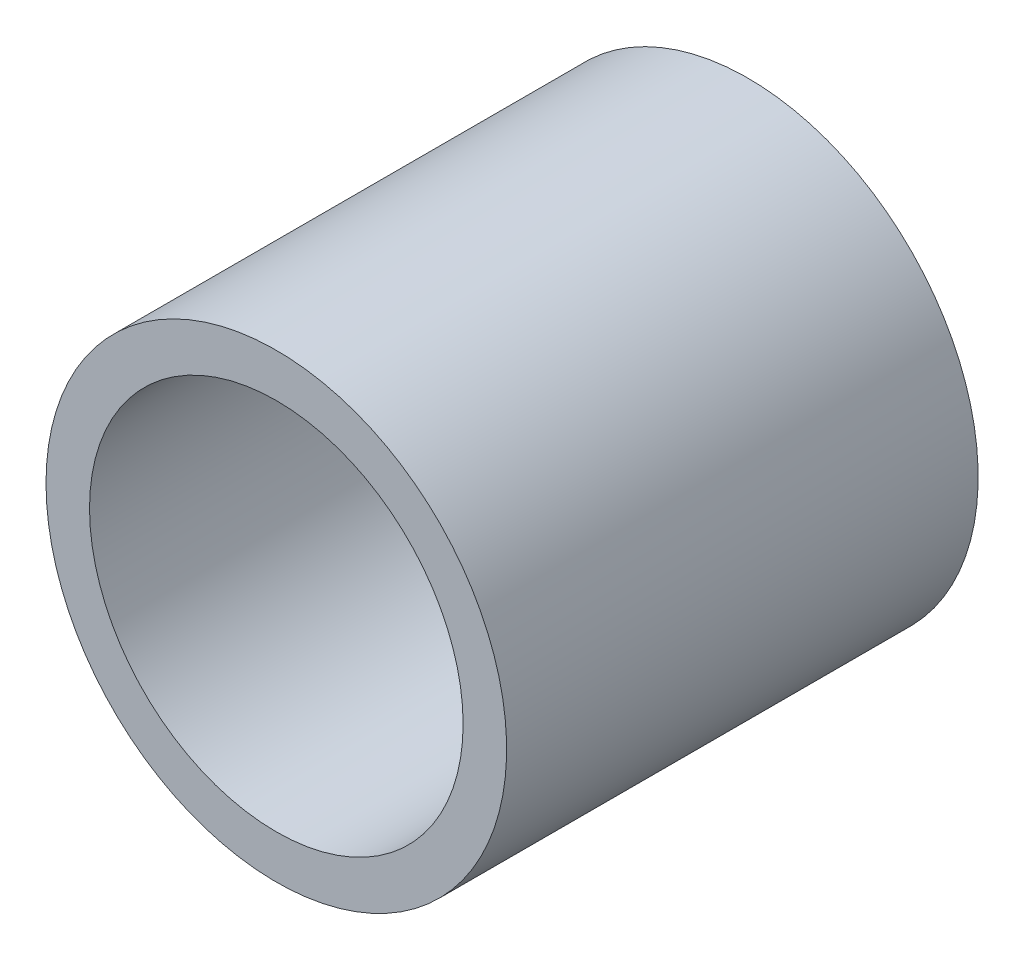
ISO-10303-21;
HEADER;
FILE_DESCRIPTION(('STEP AP214'),'2;1');
FILE_NAME('part.step','',(''),(''),'','','');
FILE_SCHEMA(('AUTOMOTIVE_DESIGN { 1 0 10303 214 1 1 1 1 }'));
ENDSEC;
DATA;
#1=APPLICATION_CONTEXT('core data for automotive mechanical design processes');
#2=APPLICATION_PROTOCOL_DEFINITION('international standard','automotive_design',2000,#1);
#3=PRODUCT_CONTEXT('',#1,'mechanical');
#4=PRODUCT('Part','Part','',(#3));
#5=PRODUCT_RELATED_PRODUCT_CATEGORY('part','',(#4));
#6=PRODUCT_DEFINITION_FORMATION('','',#4);
#7=PRODUCT_DEFINITION_CONTEXT('part definition',#1,'design');
#8=PRODUCT_DEFINITION('design','',#6,#7);
#9=PRODUCT_DEFINITION_SHAPE('','',#8);
#10=(LENGTH_UNIT() NAMED_UNIT(*) SI_UNIT(.MILLI.,.METRE.));
#11=(NAMED_UNIT(*) PLANE_ANGLE_UNIT() SI_UNIT($,.RADIAN.));
#12=(NAMED_UNIT(*) SI_UNIT($,.STERADIAN.) SOLID_ANGLE_UNIT());
#13=UNCERTAINTY_MEASURE_WITH_UNIT(LENGTH_MEASURE(1.E-05),#10,'distance_accuracy_value','');
#14=(GEOMETRIC_REPRESENTATION_CONTEXT(3) GLOBAL_UNCERTAINTY_ASSIGNED_CONTEXT((#13)) GLOBAL_UNIT_ASSIGNED_CONTEXT((#10,
#11,#12)) REPRESENTATION_CONTEXT('',''));
#15=CARTESIAN_POINT('',(0.,0.,0.));
#16=DIRECTION('',(0.,0.,1.));
#17=DIRECTION('',(1.,0.,0.));
#18=AXIS2_PLACEMENT_3D('',#15,#16,#17);
#19=CARTESIAN_POINT('',(0.,0.,13.));
#20=DIRECTION('',(0.,0.,1.));
#21=DIRECTION('',(1.,0.,0.));
#22=AXIS2_PLACEMENT_3D('',#19,#20,#21);
#23=PLANE('',#22);
#24=CARTESIAN_POINT('',(0.,0.,13.));
#25=DIRECTION('',(0.,0.,1.));
#26=DIRECTION('',(1.,0.,0.));
#27=AXIS2_PLACEMENT_3D('',#24,#25,#26);
#28=CIRCLE('',#27,6.35);
#29=CARTESIAN_POINT('',(-6.35,0.,13.));
#30=VERTEX_POINT('',#29);
#31=EDGE_CURVE('E10',#30,#30,#28,.T.);
#32=ORIENTED_EDGE('',*,*,#31,.T.);
#33=EDGE_LOOP('',(#32));
#34=FACE_BOUND('',#33,.T.);
#35=CARTESIAN_POINT('',(0.,0.,13.));
#36=DIRECTION('',(0.,0.,1.));
#37=DIRECTION('',(1.,0.,0.));
#38=AXIS2_PLACEMENT_3D('',#35,#36,#37);
#39=CIRCLE('',#38,5.15);
#40=CARTESIAN_POINT('',(-5.15,0.,13.));
#41=VERTEX_POINT('',#40);
#42=EDGE_CURVE('E44',#41,#41,#39,.T.);
#43=ORIENTED_EDGE('',*,*,#42,.F.);
#44=EDGE_LOOP('',(#43));
#45=FACE_BOUND('',#44,.T.);
#46=ADVANCED_FACE('F33',(#34,#45),#23,.T.);
#47=CARTESIAN_POINT('',(0.,0.,0.));
#48=DIRECTION('',(0.,0.,1.));
#49=DIRECTION('',(1.,0.,0.));
#50=AXIS2_PLACEMENT_3D('',#47,#48,#49);
#51=PLANE('',#50);
#52=CARTESIAN_POINT('',(0.,0.,0.));
#53=DIRECTION('',(0.,0.,1.));
#54=DIRECTION('',(1.,0.,0.));
#55=AXIS2_PLACEMENT_3D('',#52,#53,#54);
#56=CIRCLE('',#55,6.35);
#57=CARTESIAN_POINT('',(-6.35,0.,0.));
#58=VERTEX_POINT('',#57);
#59=EDGE_CURVE('E37',#58,#58,#56,.T.);
#60=ORIENTED_EDGE('',*,*,#59,.F.);
#61=EDGE_LOOP('',(#60));
#62=FACE_BOUND('',#61,.T.);
#63=CARTESIAN_POINT('',(0.,0.,0.));
#64=DIRECTION('',(0.,0.,1.));
#65=DIRECTION('',(1.,0.,0.));
#66=AXIS2_PLACEMENT_3D('',#63,#64,#65);
#67=CIRCLE('',#66,5.15);
#68=CARTESIAN_POINT('',(-5.15,0.,0.));
#69=VERTEX_POINT('',#68);
#70=EDGE_CURVE('E46',#69,#69,#67,.T.);
#71=ORIENTED_EDGE('',*,*,#70,.T.);
#72=EDGE_LOOP('',(#71));
#73=FACE_BOUND('',#72,.T.);
#74=ADVANCED_FACE('F56',(#62,#73),#51,.F.);
#75=CARTESIAN_POINT('',(0.,0.,13.));
#76=DIRECTION('',(0.,0.,-1.));
#77=DIRECTION('',(-1.,0.,0.));
#78=AXIS2_PLACEMENT_3D('',#75,#76,#77);
#79=CYLINDRICAL_SURFACE('',#78,6.35);
#80=CARTESIAN_POINT('',(-6.35,0.,13.));
#81=CARTESIAN_POINT('',(-6.35,0.,12.8645833333333));
#82=CARTESIAN_POINT('',(-6.35,0.,12.7291666666667));
#83=CARTESIAN_POINT('',(-6.35,0.,12.4583333333333));
#84=CARTESIAN_POINT('',(-6.35,0.,12.3229166666667));
#85=CARTESIAN_POINT('',(-6.35,0.,12.0520833333333));
#86=CARTESIAN_POINT('',(-6.35,0.,11.9166666666667));
#87=CARTESIAN_POINT('',(-6.35,0.,11.6458333333333));
#88=CARTESIAN_POINT('',(-6.35,0.,11.5104166666667));
#89=CARTESIAN_POINT('',(-6.35,0.,11.2395833333333));
#90=CARTESIAN_POINT('',(-6.35,0.,11.1041666666667));
#91=CARTESIAN_POINT('',(-6.35,0.,10.8333333333333));
#92=CARTESIAN_POINT('',(-6.35,0.,10.6979166666667));
#93=CARTESIAN_POINT('',(-6.35,0.,10.4270833333333));
#94=CARTESIAN_POINT('',(-6.35,0.,10.2916666666667));
#95=CARTESIAN_POINT('',(-6.35,0.,10.0208333333333));
#96=CARTESIAN_POINT('',(-6.35,0.,9.88541666666667));
#97=CARTESIAN_POINT('',(-6.35,0.,9.61458333333333));
#98=CARTESIAN_POINT('',(-6.35,0.,9.47916666666667));
#99=CARTESIAN_POINT('',(-6.35,0.,9.20833333333333));
#100=CARTESIAN_POINT('',(-6.35,0.,9.07291666666666));
#101=CARTESIAN_POINT('',(-6.35,0.,8.80208333333333));
#102=CARTESIAN_POINT('',(-6.35,0.,8.66666666666667));
#103=CARTESIAN_POINT('',(-6.35,0.,8.39583333333333));
#104=CARTESIAN_POINT('',(-6.35,0.,8.26041666666667));
#105=CARTESIAN_POINT('',(-6.35,0.,7.98958333333333));
#106=CARTESIAN_POINT('',(-6.35,0.,7.85416666666667));
#107=CARTESIAN_POINT('',(-6.35,0.,7.58333333333333));
#108=CARTESIAN_POINT('',(-6.35,0.,7.44791666666667));
#109=CARTESIAN_POINT('',(-6.35,0.,7.17708333333333));
#110=CARTESIAN_POINT('',(-6.35,0.,7.04166666666667));
#111=CARTESIAN_POINT('',(-6.35,0.,6.77083333333333));
#112=CARTESIAN_POINT('',(-6.35,0.,6.63541666666667));
#113=CARTESIAN_POINT('',(-6.35,0.,6.36458333333333));
#114=CARTESIAN_POINT('',(-6.35,0.,6.22916666666667));
#115=CARTESIAN_POINT('',(-6.35,0.,5.95833333333333));
#116=CARTESIAN_POINT('',(-6.35,0.,5.82291666666667));
#117=CARTESIAN_POINT('',(-6.35,0.,5.55208333333333));
#118=CARTESIAN_POINT('',(-6.35,0.,5.41666666666667));
#119=CARTESIAN_POINT('',(-6.35,0.,5.14583333333333));
#120=CARTESIAN_POINT('',(-6.35,0.,5.01041666666667));
#121=CARTESIAN_POINT('',(-6.35,0.,4.73958333333333));
#122=CARTESIAN_POINT('',(-6.35,0.,4.60416666666667));
#123=CARTESIAN_POINT('',(-6.35,0.,4.33333333333333));
#124=CARTESIAN_POINT('',(-6.35,0.,4.19791666666667));
#125=CARTESIAN_POINT('',(-6.35,0.,3.92708333333333));
#126=CARTESIAN_POINT('',(-6.35,0.,3.79166666666667));
#127=CARTESIAN_POINT('',(-6.35,0.,3.52083333333333));
#128=CARTESIAN_POINT('',(-6.35,0.,3.38541666666667));
#129=CARTESIAN_POINT('',(-6.35,0.,3.11458333333333));
#130=CARTESIAN_POINT('',(-6.35,0.,2.97916666666667));
#131=CARTESIAN_POINT('',(-6.35,0.,2.70833333333333));
#132=CARTESIAN_POINT('',(-6.35,0.,2.57291666666667));
#133=CARTESIAN_POINT('',(-6.35,0.,2.30208333333333));
#134=CARTESIAN_POINT('',(-6.35,0.,2.16666666666667));
#135=CARTESIAN_POINT('',(-6.35,0.,1.89583333333333));
#136=CARTESIAN_POINT('',(-6.35,0.,1.76041666666667));
#137=CARTESIAN_POINT('',(-6.35,0.,1.48958333333333));
#138=CARTESIAN_POINT('',(-6.35,0.,1.35416666666667));
#139=CARTESIAN_POINT('',(-6.35,0.,1.08333333333333));
#140=CARTESIAN_POINT('',(-6.35,0.,0.947916666666667));
#141=CARTESIAN_POINT('',(-6.35,0.,0.677083333333334));
#142=CARTESIAN_POINT('',(-6.35,0.,0.541666666666667));
#143=CARTESIAN_POINT('',(-6.35,0.,0.270833333333334));
#144=CARTESIAN_POINT('',(-6.35,0.,0.135416666666667));
#145=CARTESIAN_POINT('',(-6.35,0.,0.));
#146=B_SPLINE_CURVE_WITH_KNOTS('',3,(#80,#81,#82,#83,#84,#85,#86,#87,#88,#89,#90,#91,#92,#93,
#94,#95,#96,#97,#98,#99,#100,#101,#102,#103,#104,#105,#106,#107,#108,#109,#110,#111,#112,#113,
#114,#115,#116,#117,#118,#119,#120,#121,#122,#123,#124,#125,#126,#127,#128,#129,#130,#131,#132,
#133,#134,#135,#136,#137,#138,#139,#140,#141,#142,#143,#144,#145),.UNSPECIFIED.,.F.,.F.,(4,2,2,
2,2,2,2,2,2,2,2,2,2,2,2,2,2,2,2,2,2,2,2,2,2,2,2,2,2,2,2,2,4),(0.,0.40625,0.812500000000001,
1.21875,1.625,2.03125,2.4375,2.84375,3.25,3.65625,4.0625,4.46875,4.875,5.28125,5.6875,6.09375,
6.5,6.90625,7.3125,7.71875,8.125,8.53125,8.9375,9.34375,9.75,10.15625,10.5625,10.96875,11.375,
11.78125,12.1875,12.59375,13.),.UNSPECIFIED.);
#147=EDGE_CURVE('BSEAM35',#30,#58,#146,.T.);
#148=ORIENTED_EDGE('',*,*,#31,.F.);
#149=ORIENTED_EDGE('',*,*,#59,.T.);
#150=ORIENTED_EDGE('',*,*,#147,.T.);
#151=ORIENTED_EDGE('',*,*,#147,.F.);
#152=EDGE_LOOP('',(#148,#150,#149,#151));
#153=FACE_BOUND('',#152,.T.);
#154=ADVANCED_FACE('F35',(#153),#79,.T.);
#155=CARTESIAN_POINT('',(0.,0.,13.));
#156=DIRECTION('',(0.,0.,-1.));
#157=DIRECTION('',(-1.,0.,0.));
#158=AXIS2_PLACEMENT_3D('',#155,#156,#157);
#159=CYLINDRICAL_SURFACE('',#158,5.15);
#160=CARTESIAN_POINT('',(-5.15,0.,13.));
#161=CARTESIAN_POINT('',(-5.15,0.,12.8645833333333));
#162=CARTESIAN_POINT('',(-5.15,0.,12.7291666666667));
#163=CARTESIAN_POINT('',(-5.15,0.,12.4583333333333));
#164=CARTESIAN_POINT('',(-5.15,0.,12.3229166666667));
#165=CARTESIAN_POINT('',(-5.15,0.,12.0520833333333));
#166=CARTESIAN_POINT('',(-5.15,0.,11.9166666666667));
#167=CARTESIAN_POINT('',(-5.15,0.,11.6458333333333));
#168=CARTESIAN_POINT('',(-5.15,0.,11.5104166666667));
#169=CARTESIAN_POINT('',(-5.15,0.,11.2395833333333));
#170=CARTESIAN_POINT('',(-5.15,0.,11.1041666666667));
#171=CARTESIAN_POINT('',(-5.15,0.,10.8333333333333));
#172=CARTESIAN_POINT('',(-5.15,0.,10.6979166666667));
#173=CARTESIAN_POINT('',(-5.15,0.,10.4270833333333));
#174=CARTESIAN_POINT('',(-5.15,0.,10.2916666666667));
#175=CARTESIAN_POINT('',(-5.15,0.,10.0208333333333));
#176=CARTESIAN_POINT('',(-5.15,0.,9.88541666666667));
#177=CARTESIAN_POINT('',(-5.15,0.,9.61458333333333));
#178=CARTESIAN_POINT('',(-5.15,0.,9.47916666666667));
#179=CARTESIAN_POINT('',(-5.15,0.,9.20833333333333));
#180=CARTESIAN_POINT('',(-5.15,0.,9.07291666666666));
#181=CARTESIAN_POINT('',(-5.15,0.,8.80208333333333));
#182=CARTESIAN_POINT('',(-5.15,0.,8.66666666666667));
#183=CARTESIAN_POINT('',(-5.15,0.,8.39583333333333));
#184=CARTESIAN_POINT('',(-5.15,0.,8.26041666666667));
#185=CARTESIAN_POINT('',(-5.15,0.,7.98958333333333));
#186=CARTESIAN_POINT('',(-5.15,0.,7.85416666666667));
#187=CARTESIAN_POINT('',(-5.15,0.,7.58333333333333));
#188=CARTESIAN_POINT('',(-5.15,0.,7.44791666666667));
#189=CARTESIAN_POINT('',(-5.15,0.,7.17708333333333));
#190=CARTESIAN_POINT('',(-5.15,0.,7.04166666666667));
#191=CARTESIAN_POINT('',(-5.15,0.,6.77083333333333));
#192=CARTESIAN_POINT('',(-5.15,0.,6.63541666666667));
#193=CARTESIAN_POINT('',(-5.15,0.,6.36458333333333));
#194=CARTESIAN_POINT('',(-5.15,0.,6.22916666666667));
#195=CARTESIAN_POINT('',(-5.15,0.,5.95833333333333));
#196=CARTESIAN_POINT('',(-5.15,0.,5.82291666666667));
#197=CARTESIAN_POINT('',(-5.15,0.,5.55208333333333));
#198=CARTESIAN_POINT('',(-5.15,0.,5.41666666666667));
#199=CARTESIAN_POINT('',(-5.15,0.,5.14583333333333));
#200=CARTESIAN_POINT('',(-5.15,0.,5.01041666666667));
#201=CARTESIAN_POINT('',(-5.15,0.,4.73958333333333));
#202=CARTESIAN_POINT('',(-5.15,0.,4.60416666666667));
#203=CARTESIAN_POINT('',(-5.15,0.,4.33333333333333));
#204=CARTESIAN_POINT('',(-5.15,0.,4.19791666666667));
#205=CARTESIAN_POINT('',(-5.15,0.,3.92708333333333));
#206=CARTESIAN_POINT('',(-5.15,0.,3.79166666666667));
#207=CARTESIAN_POINT('',(-5.15,0.,3.52083333333333));
#208=CARTESIAN_POINT('',(-5.15,0.,3.38541666666667));
#209=CARTESIAN_POINT('',(-5.15,0.,3.11458333333333));
#210=CARTESIAN_POINT('',(-5.15,0.,2.97916666666667));
#211=CARTESIAN_POINT('',(-5.15,0.,2.70833333333333));
#212=CARTESIAN_POINT('',(-5.15,0.,2.57291666666667));
#213=CARTESIAN_POINT('',(-5.15,0.,2.30208333333333));
#214=CARTESIAN_POINT('',(-5.15,0.,2.16666666666667));
#215=CARTESIAN_POINT('',(-5.15,0.,1.89583333333333));
#216=CARTESIAN_POINT('',(-5.15,0.,1.76041666666667));
#217=CARTESIAN_POINT('',(-5.15,0.,1.48958333333333));
#218=CARTESIAN_POINT('',(-5.15,0.,1.35416666666667));
#219=CARTESIAN_POINT('',(-5.15,0.,1.08333333333333));
#220=CARTESIAN_POINT('',(-5.15,0.,0.947916666666667));
#221=CARTESIAN_POINT('',(-5.15,0.,0.677083333333334));
#222=CARTESIAN_POINT('',(-5.15,0.,0.541666666666667));
#223=CARTESIAN_POINT('',(-5.15,0.,0.270833333333334));
#224=CARTESIAN_POINT('',(-5.15,0.,0.135416666666667));
#225=CARTESIAN_POINT('',(-5.15,0.,0.));
#226=B_SPLINE_CURVE_WITH_KNOTS('',3,(#160,#161,#162,#163,#164,#165,#166,#167,#168,#169,#170,
#171,#172,#173,#174,#175,#176,#177,#178,#179,#180,#181,#182,#183,#184,#185,#186,#187,#188,#189,
#190,#191,#192,#193,#194,#195,#196,#197,#198,#199,#200,#201,#202,#203,#204,#205,#206,#207,#208,
#209,#210,#211,#212,#213,#214,#215,#216,#217,#218,#219,#220,#221,#222,#223,#224,#225),
.UNSPECIFIED.,.F.,.F.,(4,2,2,2,2,2,2,2,2,2,2,2,2,2,2,2,2,2,2,2,2,2,2,2,2,2,2,2,2,2,2,2,4),(0.,
0.40625,0.812500000000001,1.21875,1.625,2.03125,2.4375,2.84375,3.25,3.65625,4.0625,4.46875,
4.875,5.28125,5.6875,6.09375,6.5,6.90625,7.3125,7.71875,8.125,8.53125,8.9375,9.34375,9.75,
10.15625,10.5625,10.96875,11.375,11.78125,12.1875,12.59375,13.),.UNSPECIFIED.);
#227=EDGE_CURVE('BSEAM52',#41,#69,#226,.T.);
#228=ORIENTED_EDGE('',*,*,#42,.T.);
#229=ORIENTED_EDGE('',*,*,#70,.F.);
#230=ORIENTED_EDGE('',*,*,#227,.T.);
#231=ORIENTED_EDGE('',*,*,#227,.F.);
#232=EDGE_LOOP('',(#228,#230,#229,#231));
#233=FACE_BOUND('',#232,.T.);
#234=ADVANCED_FACE('F52',(#233),#159,.F.);
#235=CLOSED_SHELL('',(#46,#74,#154,#234));
#236=MANIFOLD_SOLID_BREP('B2',#235);
#237=ADVANCED_BREP_SHAPE_REPRESENTATION('',(#18,#236),#14);
#238=SHAPE_DEFINITION_REPRESENTATION(#9,#237);
ENDSEC;
END-ISO-10303-21;
